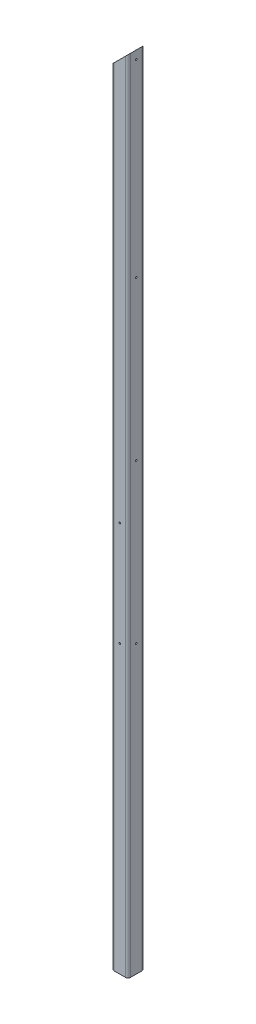
ISO-10303-21;
HEADER;
FILE_DESCRIPTION(('STEP AP214'),'2;1');
FILE_NAME('part.step','',(''),(''),'','','');
FILE_SCHEMA(('AUTOMOTIVE_DESIGN { 1 0 10303 214 1 1 1 1 }'));
ENDSEC;
DATA;
#1=APPLICATION_CONTEXT('core data for automotive mechanical design processes');
#2=APPLICATION_PROTOCOL_DEFINITION('international standard','automotive_design',2000,#1);
#3=PRODUCT_CONTEXT('',#1,'mechanical');
#4=PRODUCT('Part','Part','',(#3));
#5=PRODUCT_RELATED_PRODUCT_CATEGORY('part','',(#4));
#6=PRODUCT_DEFINITION_FORMATION('','',#4);
#7=PRODUCT_DEFINITION_CONTEXT('part definition',#1,'design');
#8=PRODUCT_DEFINITION('design','',#6,#7);
#9=PRODUCT_DEFINITION_SHAPE('','',#8);
#10=(LENGTH_UNIT() NAMED_UNIT(*) SI_UNIT(.MILLI.,.METRE.));
#11=(NAMED_UNIT(*) PLANE_ANGLE_UNIT() SI_UNIT($,.RADIAN.));
#12=(NAMED_UNIT(*) SI_UNIT($,.STERADIAN.) SOLID_ANGLE_UNIT());
#13=UNCERTAINTY_MEASURE_WITH_UNIT(LENGTH_MEASURE(1.E-05),#10,'distance_accuracy_value','');
#14=(GEOMETRIC_REPRESENTATION_CONTEXT(3) GLOBAL_UNCERTAINTY_ASSIGNED_CONTEXT((#13)) GLOBAL_UNIT_ASSIGNED_CONTEXT((#10,
#11,#12)) REPRESENTATION_CONTEXT('',''));
#15=CARTESIAN_POINT('',(0.,0.,0.));
#16=DIRECTION('',(0.,0.,1.));
#17=DIRECTION('',(1.,0.,0.));
#18=AXIS2_PLACEMENT_3D('',#15,#16,#17);
#19=CARTESIAN_POINT('',(-13.6,1920.,13.6));
#20=DIRECTION('',(0.,-1.,0.));
#21=DIRECTION('',(0.,0.,-1.));
#22=AXIS2_PLACEMENT_3D('',#19,#20,#21);
#23=CYLINDRICAL_SURFACE('',#22,6.4);
#24=CARTESIAN_POINT('',(-13.6,1886.4,13.6));
#25=DIRECTION('',(-0.707106781186548,0.707106781186547,0.));
#26=DIRECTION('',(-0.707106781186547,-0.707106781186548,0.));
#27=AXIS2_PLACEMENT_3D('',#24,#25,#26);
#28=ELLIPSE('',#27,9.05096679918782,6.4);
#29=CARTESIAN_POINT('',(-20.,1880.,13.6));
#30=VERTEX_POINT('',#29);
#31=CARTESIAN_POINT('',(-13.5999999999999,1886.4,20.));
#32=VERTEX_POINT('',#31);
#33=EDGE_CURVE('E245',#30,#32,#28,.T.);
#34=ORIENTED_EDGE('',*,*,#33,.F.);
#35=DIRECTION('',(0.,-1.,0.));
#36=VECTOR('',#35,1.);
#37=CARTESIAN_POINT('',(-20.,1920.,13.6));
#38=LINE('',#37,#36);
#39=CARTESIAN_POINT('',(-20.,0.,13.6));
#40=VERTEX_POINT('',#39);
#41=EDGE_CURVE('E161',#30,#40,#38,.T.);
#42=ORIENTED_EDGE('',*,*,#41,.T.);
#43=CARTESIAN_POINT('',(-13.6,0.,13.6));
#44=DIRECTION('',(0.,1.,0.));
#45=DIRECTION('',(0.,0.,1.));
#46=AXIS2_PLACEMENT_3D('',#43,#44,#45);
#47=CIRCLE('',#46,6.4);
#48=CARTESIAN_POINT('',(-13.6,0.,20.));
#49=VERTEX_POINT('',#48);
#50=EDGE_CURVE('E176',#40,#49,#47,.T.);
#51=ORIENTED_EDGE('',*,*,#50,.T.);
#52=DIRECTION('',(0.,-1.,0.));
#53=VECTOR('',#52,1.);
#54=CARTESIAN_POINT('',(-13.6,1920.,20.));
#55=LINE('',#54,#53);
#56=EDGE_CURVE('E12',#32,#49,#55,.T.);
#57=ORIENTED_EDGE('',*,*,#56,.F.);
#58=EDGE_LOOP('',(#34,#42,#51,#57));
#59=FACE_BOUND('',#58,.T.);
#60=ADVANCED_FACE('F66',(#59),#23,.T.);
#61=CARTESIAN_POINT('',(-13.6,1920.,20.));
#62=DIRECTION('',(0.,0.,-1.));
#63=DIRECTION('',(-1.,0.,0.));
#64=AXIS2_PLACEMENT_3D('',#61,#62,#63);
#65=PLANE('',#64);
#66=CARTESIAN_POINT('',(0.,687.,20.));
#67=DIRECTION('',(0.,0.,1.));
#68=DIRECTION('',(1.,0.,0.));
#69=AXIS2_PLACEMENT_3D('',#66,#67,#68);
#70=CIRCLE('',#69,2.);
#71=CARTESIAN_POINT('',(2.,687.,20.));
#72=VERTEX_POINT('',#71);
#73=EDGE_CURVE('E499',#72,#72,#70,.T.);
#74=ORIENTED_EDGE('',*,*,#73,.F.);
#75=EDGE_LOOP('',(#74));
#76=FACE_BOUND('',#75,.T.);
#77=CARTESIAN_POINT('',(0.,937.,20.));
#78=DIRECTION('',(0.,0.,1.));
#79=DIRECTION('',(1.,0.,0.));
#80=AXIS2_PLACEMENT_3D('',#77,#78,#79);
#81=CIRCLE('',#80,2.);
#82=CARTESIAN_POINT('',(1.99999999999991,937.,20.));
#83=VERTEX_POINT('',#82);
#84=EDGE_CURVE('E506',#83,#83,#81,.T.);
#85=ORIENTED_EDGE('',*,*,#84,.F.);
#86=EDGE_LOOP('',(#85));
#87=FACE_BOUND('',#86,.T.);
#88=DIRECTION('',(0.707106781186547,0.707106781186548,0.));
#89=VECTOR('',#88,1.);
#90=CARTESIAN_POINT('',(-950.,950.,20.));
#91=LINE('',#90,#89);
#92=CARTESIAN_POINT('',(13.6,1913.6,20.));
#93=VERTEX_POINT('',#92);
#94=EDGE_CURVE('E350',#32,#93,#91,.T.);
#95=ORIENTED_EDGE('',*,*,#94,.F.);
#96=ORIENTED_EDGE('',*,*,#56,.T.);
#97=DIRECTION('',(1.,0.,0.));
#98=VECTOR('',#97,1.);
#99=CARTESIAN_POINT('',(-13.6,0.,20.));
#100=LINE('',#99,#98);
#101=CARTESIAN_POINT('',(13.6,0.,20.));
#102=VERTEX_POINT('',#101);
#103=EDGE_CURVE('E274',#49,#102,#100,.T.);
#104=ORIENTED_EDGE('',*,*,#103,.T.);
#105=DIRECTION('',(0.,-1.,0.));
#106=VECTOR('',#105,1.);
#107=CARTESIAN_POINT('',(13.6,1920.,20.));
#108=LINE('',#107,#106);
#109=EDGE_CURVE('E76',#93,#102,#108,.T.);
#110=ORIENTED_EDGE('',*,*,#109,.F.);
#111=EDGE_LOOP('',(#95,#96,#104,#110));
#112=FACE_BOUND('',#111,.T.);
#113=ADVANCED_FACE('F356',(#76,#87,#112),#65,.F.);
#114=CARTESIAN_POINT('',(13.6,1920.,13.6));
#115=DIRECTION('',(0.,-1.,0.));
#116=DIRECTION('',(0.,0.,-1.));
#117=AXIS2_PLACEMENT_3D('',#114,#115,#116);
#118=CYLINDRICAL_SURFACE('',#117,6.4);
#119=CARTESIAN_POINT('',(13.6,1913.6,13.6));
#120=DIRECTION('',(-0.707106781186548,0.707106781186547,0.));
#121=DIRECTION('',(-0.707106781186547,-0.707106781186548,0.));
#122=AXIS2_PLACEMENT_3D('',#119,#120,#121);
#123=ELLIPSE('',#122,9.05096679918782,6.4);
#124=CARTESIAN_POINT('',(20.,1920.,13.6));
#125=VERTEX_POINT('',#124);
#126=EDGE_CURVE('E93',#93,#125,#123,.T.);
#127=ORIENTED_EDGE('',*,*,#126,.F.);
#128=ORIENTED_EDGE('',*,*,#109,.T.);
#129=CARTESIAN_POINT('',(13.6,0.,13.6));
#130=DIRECTION('',(0.,1.,0.));
#131=DIRECTION('',(0.,0.,1.));
#132=AXIS2_PLACEMENT_3D('',#129,#130,#131);
#133=CIRCLE('',#132,6.4);
#134=CARTESIAN_POINT('',(20.,0.,13.6));
#135=VERTEX_POINT('',#134);
#136=EDGE_CURVE('E278',#102,#135,#133,.T.);
#137=ORIENTED_EDGE('',*,*,#136,.T.);
#138=DIRECTION('',(0.,-1.,0.));
#139=VECTOR('',#138,1.);
#140=CARTESIAN_POINT('',(20.,1920.,13.6));
#141=LINE('',#140,#139);
#142=EDGE_CURVE('E196',#125,#135,#141,.T.);
#143=ORIENTED_EDGE('',*,*,#142,.F.);
#144=EDGE_LOOP('',(#127,#128,#137,#143));
#145=FACE_BOUND('',#144,.T.);
#146=ADVANCED_FACE('F425',(#145),#118,.T.);
#147=CARTESIAN_POINT('',(13.6,1920.,-13.6));
#148=DIRECTION('',(0.,-1.,0.));
#149=DIRECTION('',(0.,0.,-1.));
#150=AXIS2_PLACEMENT_3D('',#147,#148,#149);
#151=CYLINDRICAL_SURFACE('',#150,6.4);
#152=CARTESIAN_POINT('',(13.6,1913.6,-13.6));
#153=DIRECTION('',(-0.707106781186548,0.707106781186547,0.));
#154=DIRECTION('',(-0.707106781186547,-0.707106781186548,0.));
#155=AXIS2_PLACEMENT_3D('',#152,#153,#154);
#156=ELLIPSE('',#155,9.05096679918781,6.4);
#157=CARTESIAN_POINT('',(20.,1920.,-13.6));
#158=VERTEX_POINT('',#157);
#159=CARTESIAN_POINT('',(13.6000000000003,1913.6,-20.));
#160=VERTEX_POINT('',#159);
#161=EDGE_CURVE('E303',#158,#160,#156,.T.);
#162=ORIENTED_EDGE('',*,*,#161,.F.);
#163=DIRECTION('',(0.,-1.,0.));
#164=VECTOR('',#163,1.);
#165=CARTESIAN_POINT('',(20.,1920.,-13.6));
#166=LINE('',#165,#164);
#167=CARTESIAN_POINT('',(20.,0.,-13.6));
#168=VERTEX_POINT('',#167);
#169=EDGE_CURVE('E192',#158,#168,#166,.T.);
#170=ORIENTED_EDGE('',*,*,#169,.T.);
#171=CARTESIAN_POINT('',(13.6,0.,-13.6));
#172=DIRECTION('',(0.,1.,0.));
#173=DIRECTION('',(0.,0.,1.));
#174=AXIS2_PLACEMENT_3D('',#171,#172,#173);
#175=CIRCLE('',#174,6.4);
#176=CARTESIAN_POINT('',(13.6,0.,-20.));
#177=VERTEX_POINT('',#176);
#178=EDGE_CURVE('E284',#168,#177,#175,.T.);
#179=ORIENTED_EDGE('',*,*,#178,.T.);
#180=DIRECTION('',(0.,-1.,0.));
#181=VECTOR('',#180,1.);
#182=CARTESIAN_POINT('',(13.6,1920.,-20.));
#183=LINE('',#182,#181);
#184=EDGE_CURVE('E189',#160,#177,#183,.T.);
#185=ORIENTED_EDGE('',*,*,#184,.F.);
#186=EDGE_LOOP('',(#162,#170,#179,#185));
#187=FACE_BOUND('',#186,.T.);
#188=ADVANCED_FACE('F298',(#187),#151,.T.);
#189=CARTESIAN_POINT('',(13.6,1920.,-20.));
#190=DIRECTION('',(0.,0.,1.));
#191=DIRECTION('',(1.,0.,0.));
#192=AXIS2_PLACEMENT_3D('',#189,#190,#191);
#193=PLANE('',#192);
#194=DIRECTION('',(0.707106781186547,0.707106781186548,0.));
#195=VECTOR('',#194,1.);
#196=CARTESIAN_POINT('',(-950.,950.,-20.));
#197=LINE('',#196,#195);
#198=CARTESIAN_POINT('',(-13.6,1886.4,-20.));
#199=VERTEX_POINT('',#198);
#200=EDGE_CURVE('E358',#199,#160,#197,.T.);
#201=ORIENTED_EDGE('',*,*,#200,.T.);
#202=ORIENTED_EDGE('',*,*,#184,.T.);
#203=DIRECTION('',(-1.,0.,0.));
#204=VECTOR('',#203,1.);
#205=CARTESIAN_POINT('',(13.6,0.,-20.));
#206=LINE('',#205,#204);
#207=CARTESIAN_POINT('',(-13.6,0.,-20.));
#208=VERTEX_POINT('',#207);
#209=EDGE_CURVE('E171',#177,#208,#206,.T.);
#210=ORIENTED_EDGE('',*,*,#209,.T.);
#211=DIRECTION('',(0.,-1.,0.));
#212=VECTOR('',#211,1.);
#213=CARTESIAN_POINT('',(-13.6,1920.,-20.));
#214=LINE('',#213,#212);
#215=EDGE_CURVE('E160',#199,#208,#214,.T.);
#216=ORIENTED_EDGE('',*,*,#215,.F.);
#217=EDGE_LOOP('',(#201,#202,#210,#216));
#218=FACE_BOUND('',#217,.T.);
#219=ADVANCED_FACE('F290',(#218),#193,.F.);
#220=CARTESIAN_POINT('',(-13.6,1920.,-13.6));
#221=DIRECTION('',(0.,-1.,0.));
#222=DIRECTION('',(0.,0.,-1.));
#223=AXIS2_PLACEMENT_3D('',#220,#221,#222);
#224=CYLINDRICAL_SURFACE('',#223,6.4);
#225=CARTESIAN_POINT('',(-13.6,1886.4,-13.6));
#226=DIRECTION('',(-0.707106781186548,0.707106781186547,0.));
#227=DIRECTION('',(-0.707106781186547,-0.707106781186548,0.));
#228=AXIS2_PLACEMENT_3D('',#225,#226,#227);
#229=ELLIPSE('',#228,9.05096679918782,6.4);
#230=CARTESIAN_POINT('',(-20.,1880.,-13.6));
#231=VERTEX_POINT('',#230);
#232=EDGE_CURVE('E331',#199,#231,#229,.T.);
#233=ORIENTED_EDGE('',*,*,#232,.F.);
#234=ORIENTED_EDGE('',*,*,#215,.T.);
#235=CARTESIAN_POINT('',(-13.6,0.,-13.6));
#236=DIRECTION('',(0.,1.,0.));
#237=DIRECTION('',(0.,0.,1.));
#238=AXIS2_PLACEMENT_3D('',#235,#236,#237);
#239=CIRCLE('',#238,6.4);
#240=CARTESIAN_POINT('',(-20.,0.,-13.6));
#241=VERTEX_POINT('',#240);
#242=EDGE_CURVE('E164',#208,#241,#239,.T.);
#243=ORIENTED_EDGE('',*,*,#242,.T.);
#244=DIRECTION('',(0.,-1.,0.));
#245=VECTOR('',#244,1.);
#246=CARTESIAN_POINT('',(-20.,1920.,-13.6));
#247=LINE('',#246,#245);
#248=EDGE_CURVE('E147',#231,#241,#247,.T.);
#249=ORIENTED_EDGE('',*,*,#248,.F.);
#250=EDGE_LOOP('',(#233,#234,#243,#249));
#251=FACE_BOUND('',#250,.T.);
#252=ADVANCED_FACE('F165',(#251),#224,.T.);
#253=CARTESIAN_POINT('',(13.6,1920.,13.6));
#254=DIRECTION('',(0.,-1.,0.));
#255=DIRECTION('',(0.,0.,-1.));
#256=AXIS2_PLACEMENT_3D('',#253,#254,#255);
#257=CYLINDRICAL_SURFACE('',#256,3.2);
#258=DIRECTION('',(0.,-1.,0.));
#259=VECTOR('',#258,1.);
#260=CARTESIAN_POINT('',(13.6,1920.,16.8));
#261=LINE('',#260,#259);
#262=CARTESIAN_POINT('',(13.6,1913.6,16.8));
#263=VERTEX_POINT('',#262);
#264=CARTESIAN_POINT('',(13.6,0.,16.8));
#265=VERTEX_POINT('',#264);
#266=EDGE_CURVE('E70',#263,#265,#261,.T.);
#267=ORIENTED_EDGE('',*,*,#266,.F.);
#268=CARTESIAN_POINT('',(13.6,1913.6,13.6));
#269=DIRECTION('',(-0.707106781186548,0.707106781186547,0.));
#270=DIRECTION('',(-0.707106781186547,-0.707106781186548,0.));
#271=AXIS2_PLACEMENT_3D('',#268,#269,#270);
#272=ELLIPSE('',#271,4.52548339959391,3.2);
#273=CARTESIAN_POINT('',(16.8,1916.8,13.6));
#274=VERTEX_POINT('',#273);
#275=EDGE_CURVE('E327',#263,#274,#272,.T.);
#276=ORIENTED_EDGE('',*,*,#275,.T.);
#277=DIRECTION('',(0.,-1.,0.));
#278=VECTOR('',#277,1.);
#279=CARTESIAN_POINT('',(16.8,1920.,13.6));
#280=LINE('',#279,#278);
#281=CARTESIAN_POINT('',(16.8,0.,13.6));
#282=VERTEX_POINT('',#281);
#283=EDGE_CURVE('E181',#274,#282,#280,.T.);
#284=ORIENTED_EDGE('',*,*,#283,.T.);
#285=CARTESIAN_POINT('',(13.6,0.,13.6));
#286=DIRECTION('',(0.,1.,0.));
#287=DIRECTION('',(0.,0.,1.));
#288=AXIS2_PLACEMENT_3D('',#285,#286,#287);
#289=CIRCLE('',#288,3.2);
#290=EDGE_CURVE('E239',#265,#282,#289,.T.);
#291=ORIENTED_EDGE('',*,*,#290,.F.);
#292=EDGE_LOOP('',(#267,#276,#284,#291));
#293=FACE_BOUND('',#292,.T.);
#294=ADVANCED_FACE('F68',(#293),#257,.F.);
#295=CARTESIAN_POINT('',(-13.6,1920.,16.8));
#296=DIRECTION('',(0.,0.,-1.));
#297=DIRECTION('',(-1.,0.,0.));
#298=AXIS2_PLACEMENT_3D('',#295,#296,#297);
#299=PLANE('',#298);
#300=DIRECTION('',(0.,-1.,0.));
#301=VECTOR('',#300,1.);
#302=CARTESIAN_POINT('',(-13.6,1920.,16.8));
#303=LINE('',#302,#301);
#304=CARTESIAN_POINT('',(-13.6,1886.4,16.8));
#305=VERTEX_POINT('',#304);
#306=CARTESIAN_POINT('',(-13.6,0.,16.8));
#307=VERTEX_POINT('',#306);
#308=EDGE_CURVE('E218',#305,#307,#303,.T.);
#309=ORIENTED_EDGE('',*,*,#308,.F.);
#310=DIRECTION('',(0.707106781186547,0.707106781186548,0.));
#311=VECTOR('',#310,1.);
#312=CARTESIAN_POINT('',(3.19999999999985,1903.2,16.8));
#313=LINE('',#312,#311);
#314=EDGE_CURVE('E235',#305,#263,#313,.T.);
#315=ORIENTED_EDGE('',*,*,#314,.T.);
#316=ORIENTED_EDGE('',*,*,#266,.T.);
#317=DIRECTION('',(1.,0.,0.));
#318=VECTOR('',#317,1.);
#319=CARTESIAN_POINT('',(-13.6,0.,16.8));
#320=LINE('',#319,#318);
#321=EDGE_CURVE('E232',#307,#265,#320,.T.);
#322=ORIENTED_EDGE('',*,*,#321,.F.);
#323=EDGE_LOOP('',(#309,#315,#316,#322));
#324=FACE_BOUND('',#323,.T.);
#325=ADVANCED_FACE('F230',(#324),#299,.T.);
#326=CARTESIAN_POINT('',(-13.6,1920.,13.6));
#327=DIRECTION('',(0.,-1.,0.));
#328=DIRECTION('',(0.,0.,-1.));
#329=AXIS2_PLACEMENT_3D('',#326,#327,#328);
#330=CYLINDRICAL_SURFACE('',#329,3.2);
#331=DIRECTION('',(0.,-1.,0.));
#332=VECTOR('',#331,1.);
#333=CARTESIAN_POINT('',(-16.8,1920.,13.6));
#334=LINE('',#333,#332);
#335=CARTESIAN_POINT('',(-16.8,1883.2,13.6));
#336=VERTEX_POINT('',#335);
#337=CARTESIAN_POINT('',(-16.8,0.,13.6));
#338=VERTEX_POINT('',#337);
#339=EDGE_CURVE('E216',#336,#338,#334,.T.);
#340=ORIENTED_EDGE('',*,*,#339,.F.);
#341=CARTESIAN_POINT('',(-13.6,1886.4,13.6));
#342=DIRECTION('',(-0.707106781186548,0.707106781186547,0.));
#343=DIRECTION('',(-0.707106781186547,-0.707106781186548,0.));
#344=AXIS2_PLACEMENT_3D('',#341,#342,#343);
#345=ELLIPSE('',#344,4.5254833995939,3.2);
#346=EDGE_CURVE('E336',#336,#305,#345,.T.);
#347=ORIENTED_EDGE('',*,*,#346,.T.);
#348=ORIENTED_EDGE('',*,*,#308,.T.);
#349=CARTESIAN_POINT('',(-13.6,0.,13.6));
#350=DIRECTION('',(0.,1.,0.));
#351=DIRECTION('',(0.,0.,1.));
#352=AXIS2_PLACEMENT_3D('',#349,#350,#351);
#353=CIRCLE('',#352,3.2);
#354=EDGE_CURVE('E248',#338,#307,#353,.T.);
#355=ORIENTED_EDGE('',*,*,#354,.F.);
#356=EDGE_LOOP('',(#340,#347,#348,#355));
#357=FACE_BOUND('',#356,.T.);
#358=ADVANCED_FACE('F392',(#357),#330,.F.);
#359=CARTESIAN_POINT('',(-16.8,1920.,13.6));
#360=DIRECTION('',(1.,0.,0.));
#361=DIRECTION('',(0.,0.,-1.));
#362=AXIS2_PLACEMENT_3D('',#359,#360,#361);
#363=PLANE('',#362);
#364=DIRECTION('',(0.,-1.,0.));
#365=VECTOR('',#364,1.);
#366=CARTESIAN_POINT('',(-16.8,1920.,-13.6));
#367=LINE('',#366,#365);
#368=CARTESIAN_POINT('',(-16.8,1883.2,-13.6));
#369=VERTEX_POINT('',#368);
#370=CARTESIAN_POINT('',(-16.8,0.,-13.6));
#371=VERTEX_POINT('',#370);
#372=EDGE_CURVE('E213',#369,#371,#367,.T.);
#373=ORIENTED_EDGE('',*,*,#372,.F.);
#374=DIRECTION('',(0.,0.,1.));
#375=VECTOR('',#374,1.);
#376=CARTESIAN_POINT('',(-16.8,1883.2,13.6));
#377=LINE('',#376,#375);
#378=EDGE_CURVE('E387',#369,#336,#377,.T.);
#379=ORIENTED_EDGE('',*,*,#378,.T.);
#380=ORIENTED_EDGE('',*,*,#339,.T.);
#381=DIRECTION('',(0.,0.,1.));
#382=VECTOR('',#381,1.);
#383=CARTESIAN_POINT('',(-16.8,0.,13.6));
#384=LINE('',#383,#382);
#385=EDGE_CURVE('E252',#371,#338,#384,.T.);
#386=ORIENTED_EDGE('',*,*,#385,.F.);
#387=EDGE_LOOP('',(#373,#379,#380,#386));
#388=FACE_BOUND('',#387,.T.);
#389=ADVANCED_FACE('F395',(#388),#363,.T.);
#390=CARTESIAN_POINT('',(-13.6,1920.,-13.6));
#391=DIRECTION('',(0.,-1.,0.));
#392=DIRECTION('',(0.,0.,-1.));
#393=AXIS2_PLACEMENT_3D('',#390,#391,#392);
#394=CYLINDRICAL_SURFACE('',#393,3.2);
#395=DIRECTION('',(0.,-1.,0.));
#396=VECTOR('',#395,1.);
#397=CARTESIAN_POINT('',(-13.6,1920.,-16.8));
#398=LINE('',#397,#396);
#399=CARTESIAN_POINT('',(-13.6,1886.4,-16.8));
#400=VERTEX_POINT('',#399);
#401=CARTESIAN_POINT('',(-13.6,0.,-16.8));
#402=VERTEX_POINT('',#401);
#403=EDGE_CURVE('E210',#400,#402,#398,.T.);
#404=ORIENTED_EDGE('',*,*,#403,.F.);
#405=CARTESIAN_POINT('',(-13.6,1886.4,-13.6));
#406=DIRECTION('',(-0.707106781186548,0.707106781186547,0.));
#407=DIRECTION('',(-0.707106781186547,-0.707106781186548,0.));
#408=AXIS2_PLACEMENT_3D('',#405,#406,#407);
#409=ELLIPSE('',#408,4.5254833995939,3.2);
#410=EDGE_CURVE('E383',#400,#369,#409,.T.);
#411=ORIENTED_EDGE('',*,*,#410,.T.);
#412=ORIENTED_EDGE('',*,*,#372,.T.);
#413=CARTESIAN_POINT('',(-13.6,0.,-13.6));
#414=DIRECTION('',(0.,1.,0.));
#415=DIRECTION('',(0.,0.,1.));
#416=AXIS2_PLACEMENT_3D('',#413,#414,#415);
#417=CIRCLE('',#416,3.2);
#418=EDGE_CURVE('E257',#402,#371,#417,.T.);
#419=ORIENTED_EDGE('',*,*,#418,.F.);
#420=EDGE_LOOP('',(#404,#411,#412,#419));
#421=FACE_BOUND('',#420,.T.);
#422=ADVANCED_FACE('F400',(#421),#394,.F.);
#423=CARTESIAN_POINT('',(13.6,1920.,-16.8));
#424=DIRECTION('',(0.,0.,1.));
#425=DIRECTION('',(1.,0.,0.));
#426=AXIS2_PLACEMENT_3D('',#423,#424,#425);
#427=PLANE('',#426);
#428=DIRECTION('',(0.,-1.,0.));
#429=VECTOR('',#428,1.);
#430=CARTESIAN_POINT('',(13.6,1920.,-16.8));
#431=LINE('',#430,#429);
#432=CARTESIAN_POINT('',(13.6,1913.6,-16.8));
#433=VERTEX_POINT('',#432);
#434=CARTESIAN_POINT('',(13.6,0.,-16.8));
#435=VERTEX_POINT('',#434);
#436=EDGE_CURVE('E207',#433,#435,#431,.T.);
#437=ORIENTED_EDGE('',*,*,#436,.F.);
#438=DIRECTION('',(-0.707106781186547,-0.707106781186548,0.));
#439=VECTOR('',#438,1.);
#440=CARTESIAN_POINT('',(16.7999999999999,1916.8,-16.8));
#441=LINE('',#440,#439);
#442=EDGE_CURVE('E379',#433,#400,#441,.T.);
#443=ORIENTED_EDGE('',*,*,#442,.T.);
#444=ORIENTED_EDGE('',*,*,#403,.T.);
#445=DIRECTION('',(-1.,0.,0.));
#446=VECTOR('',#445,1.);
#447=CARTESIAN_POINT('',(13.6,0.,-16.8));
#448=LINE('',#447,#446);
#449=EDGE_CURVE('E261',#435,#402,#448,.T.);
#450=ORIENTED_EDGE('',*,*,#449,.F.);
#451=EDGE_LOOP('',(#437,#443,#444,#450));
#452=FACE_BOUND('',#451,.T.);
#453=ADVANCED_FACE('F403',(#452),#427,.T.);
#454=CARTESIAN_POINT('',(13.6,1920.,-13.6));
#455=DIRECTION('',(0.,-1.,0.));
#456=DIRECTION('',(0.,0.,-1.));
#457=AXIS2_PLACEMENT_3D('',#454,#455,#456);
#458=CYLINDRICAL_SURFACE('',#457,3.2);
#459=DIRECTION('',(0.,-1.,0.));
#460=VECTOR('',#459,1.);
#461=CARTESIAN_POINT('',(16.8,1920.,-13.6));
#462=LINE('',#461,#460);
#463=CARTESIAN_POINT('',(16.8,1916.8,-13.6));
#464=VERTEX_POINT('',#463);
#465=CARTESIAN_POINT('',(16.8,0.,-13.6));
#466=VERTEX_POINT('',#465);
#467=EDGE_CURVE('E204',#464,#466,#462,.T.);
#468=ORIENTED_EDGE('',*,*,#467,.F.);
#469=CARTESIAN_POINT('',(13.6,1913.6,-13.6));
#470=DIRECTION('',(-0.707106781186548,0.707106781186547,0.));
#471=DIRECTION('',(-0.707106781186547,-0.707106781186548,0.));
#472=AXIS2_PLACEMENT_3D('',#469,#470,#471);
#473=ELLIPSE('',#472,4.5254833995939,3.2);
#474=EDGE_CURVE('E84',#464,#433,#473,.T.);
#475=ORIENTED_EDGE('',*,*,#474,.T.);
#476=ORIENTED_EDGE('',*,*,#436,.T.);
#477=CARTESIAN_POINT('',(13.6,0.,-13.6));
#478=DIRECTION('',(0.,1.,0.));
#479=DIRECTION('',(0.,0.,1.));
#480=AXIS2_PLACEMENT_3D('',#477,#478,#479);
#481=CIRCLE('',#480,3.2);
#482=EDGE_CURVE('E265',#466,#435,#481,.T.);
#483=ORIENTED_EDGE('',*,*,#482,.F.);
#484=EDGE_LOOP('',(#468,#475,#476,#483));
#485=FACE_BOUND('',#484,.T.);
#486=ADVANCED_FACE('F408',(#485),#458,.F.);
#487=CARTESIAN_POINT('',(16.8,1920.,-13.6));
#488=DIRECTION('',(-1.,0.,0.));
#489=DIRECTION('',(0.,0.,1.));
#490=AXIS2_PLACEMENT_3D('',#487,#488,#489);
#491=PLANE('',#490);
#492=ORIENTED_EDGE('',*,*,#283,.F.);
#493=DIRECTION('',(0.,0.,-1.));
#494=VECTOR('',#493,1.);
#495=CARTESIAN_POINT('',(16.8,1916.8,-13.6));
#496=LINE('',#495,#494);
#497=EDGE_CURVE('E329',#274,#464,#496,.T.);
#498=ORIENTED_EDGE('',*,*,#497,.T.);
#499=ORIENTED_EDGE('',*,*,#467,.T.);
#500=DIRECTION('',(0.,0.,-1.));
#501=VECTOR('',#500,1.);
#502=CARTESIAN_POINT('',(16.8,0.,-13.6));
#503=LINE('',#502,#501);
#504=EDGE_CURVE('E269',#282,#466,#503,.T.);
#505=ORIENTED_EDGE('',*,*,#504,.F.);
#506=EDGE_LOOP('',(#492,#498,#499,#505));
#507=FACE_BOUND('',#506,.T.);
#508=ADVANCED_FACE('F410',(#507),#491,.T.);
#509=CARTESIAN_POINT('',(-20.,1920.,13.6));
#510=DIRECTION('',(1.,0.,0.));
#511=DIRECTION('',(0.,0.,-1.));
#512=AXIS2_PLACEMENT_3D('',#509,#510,#511);
#513=PLANE('',#512);
#514=DIRECTION('',(0.,0.,-1.));
#515=VECTOR('',#514,1.);
#516=CARTESIAN_POINT('',(-20.,1880.,20.));
#517=LINE('',#516,#515);
#518=EDGE_CURVE('E156',#30,#231,#517,.T.);
#519=ORIENTED_EDGE('',*,*,#518,.T.);
#520=ORIENTED_EDGE('',*,*,#248,.T.);
#521=DIRECTION('',(0.,0.,1.));
#522=VECTOR('',#521,1.);
#523=CARTESIAN_POINT('',(-20.,0.,13.6));
#524=LINE('',#523,#522);
#525=EDGE_CURVE('E152',#241,#40,#524,.T.);
#526=ORIENTED_EDGE('',*,*,#525,.T.);
#527=ORIENTED_EDGE('',*,*,#41,.F.);
#528=EDGE_LOOP('',(#519,#520,#526,#527));
#529=FACE_BOUND('',#528,.T.);
#530=ADVANCED_FACE('F149',(#529),#513,.F.);
#531=CARTESIAN_POINT('',(20.,1920.,-13.6));
#532=DIRECTION('',(-1.,0.,0.));
#533=DIRECTION('',(0.,0.,1.));
#534=AXIS2_PLACEMENT_3D('',#531,#532,#533);
#535=PLANE('',#534);
#536=CARTESIAN_POINT('',(20.,1900.,0.));
#537=DIRECTION('',(1.,0.,0.));
#538=DIRECTION('',(0.,0.,-1.));
#539=AXIS2_PLACEMENT_3D('',#536,#537,#538);
#540=CIRCLE('',#539,2.);
#541=CARTESIAN_POINT('',(20.,1900.,-2.00000000000001));
#542=VERTEX_POINT('',#541);
#543=EDGE_CURVE('E369',#542,#542,#540,.T.);
#544=ORIENTED_EDGE('',*,*,#543,.F.);
#545=EDGE_LOOP('',(#544));
#546=FACE_BOUND('',#545,.T.);
#547=CARTESIAN_POINT('',(20.,1447.,0.));
#548=DIRECTION('',(1.,0.,0.));
#549=DIRECTION('',(0.,0.,-1.));
#550=AXIS2_PLACEMENT_3D('',#547,#548,#549);
#551=CIRCLE('',#550,2.);
#552=CARTESIAN_POINT('',(20.,1447.,-2.00000000000007));
#553=VERTEX_POINT('',#552);
#554=EDGE_CURVE('E523',#553,#553,#551,.T.);
#555=ORIENTED_EDGE('',*,*,#554,.F.);
#556=EDGE_LOOP('',(#555));
#557=FACE_BOUND('',#556,.T.);
#558=CARTESIAN_POINT('',(20.,1067.,-1.10920259905105E-13));
#559=DIRECTION('',(1.,0.,0.));
#560=DIRECTION('',(0.,0.,-1.));
#561=AXIS2_PLACEMENT_3D('',#558,#559,#560);
#562=CIRCLE('',#561,2.);
#563=CARTESIAN_POINT('',(20.,1067.,-2.00000000000011));
#564=VERTEX_POINT('',#563);
#565=EDGE_CURVE('E531',#564,#564,#562,.T.);
#566=ORIENTED_EDGE('',*,*,#565,.F.);
#567=EDGE_LOOP('',(#566));
#568=FACE_BOUND('',#567,.T.);
#569=CARTESIAN_POINT('',(20.,687.,-1.57757793756479E-13));
#570=DIRECTION('',(1.,0.,0.));
#571=DIRECTION('',(0.,0.,-1.));
#572=AXIS2_PLACEMENT_3D('',#569,#570,#571);
#573=CIRCLE('',#572,2.);
#574=CARTESIAN_POINT('',(20.,687.,-2.00000000000016));
#575=VERTEX_POINT('',#574);
#576=EDGE_CURVE('E498',#575,#575,#573,.T.);
#577=ORIENTED_EDGE('',*,*,#576,.F.);
#578=EDGE_LOOP('',(#577));
#579=FACE_BOUND('',#578,.T.);
#580=DIRECTION('',(0.,0.,-1.));
#581=VECTOR('',#580,1.);
#582=CARTESIAN_POINT('',(20.,0.,-13.6));
#583=LINE('',#582,#581);
#584=EDGE_CURVE('E281',#135,#168,#583,.T.);
#585=ORIENTED_EDGE('',*,*,#584,.T.);
#586=ORIENTED_EDGE('',*,*,#169,.F.);
#587=DIRECTION('',(0.,0.,-1.));
#588=VECTOR('',#587,1.);
#589=CARTESIAN_POINT('',(20.,1920.,-13.6));
#590=LINE('',#589,#588);
#591=EDGE_CURVE('E178',#125,#158,#590,.T.);
#592=ORIENTED_EDGE('',*,*,#591,.F.);
#593=ORIENTED_EDGE('',*,*,#142,.T.);
#594=EDGE_LOOP('',(#585,#586,#592,#593));
#595=FACE_BOUND('',#594,.T.);
#596=ADVANCED_FACE('F306',(#546,#557,#568,#579,#595),#535,.F.);
#597=CARTESIAN_POINT('',(-13.6,0.,13.6));
#598=DIRECTION('',(0.,1.,0.));
#599=DIRECTION('',(0.,0.,1.));
#600=AXIS2_PLACEMENT_3D('',#597,#598,#599);
#601=PLANE('',#600);
#602=ORIENTED_EDGE('',*,*,#290,.T.);
#603=ORIENTED_EDGE('',*,*,#504,.T.);
#604=ORIENTED_EDGE('',*,*,#482,.T.);
#605=ORIENTED_EDGE('',*,*,#449,.T.);
#606=ORIENTED_EDGE('',*,*,#418,.T.);
#607=ORIENTED_EDGE('',*,*,#385,.T.);
#608=ORIENTED_EDGE('',*,*,#354,.T.);
#609=ORIENTED_EDGE('',*,*,#321,.T.);
#610=EDGE_LOOP('',(#602,#603,#604,#605,#606,#607,#608,#609));
#611=FACE_BOUND('',#610,.T.);
#612=ORIENTED_EDGE('',*,*,#50,.F.);
#613=ORIENTED_EDGE('',*,*,#525,.F.);
#614=ORIENTED_EDGE('',*,*,#242,.F.);
#615=ORIENTED_EDGE('',*,*,#209,.F.);
#616=ORIENTED_EDGE('',*,*,#178,.F.);
#617=ORIENTED_EDGE('',*,*,#584,.F.);
#618=ORIENTED_EDGE('',*,*,#136,.F.);
#619=ORIENTED_EDGE('',*,*,#103,.F.);
#620=EDGE_LOOP('',(#612,#613,#614,#615,#616,#617,#618,#619));
#621=FACE_BOUND('',#620,.T.);
#622=ADVANCED_FACE('F173',(#611,#621),#601,.F.);
#623=CARTESIAN_POINT('',(-950.,950.,20.));
#624=DIRECTION('',(-0.707106781186548,0.707106781186547,0.));
#625=DIRECTION('',(-0.707106781186547,-0.707106781186548,0.));
#626=AXIS2_PLACEMENT_3D('',#623,#624,#625);
#627=PLANE('',#626);
#628=ORIENTED_EDGE('',*,*,#314,.F.);
#629=ORIENTED_EDGE('',*,*,#346,.F.);
#630=ORIENTED_EDGE('',*,*,#378,.F.);
#631=ORIENTED_EDGE('',*,*,#410,.F.);
#632=ORIENTED_EDGE('',*,*,#442,.F.);
#633=ORIENTED_EDGE('',*,*,#474,.F.);
#634=ORIENTED_EDGE('',*,*,#497,.F.);
#635=ORIENTED_EDGE('',*,*,#275,.F.);
#636=EDGE_LOOP('',(#628,#629,#630,#631,#632,#633,#634,#635));
#637=FACE_BOUND('',#636,.T.);
#638=ORIENTED_EDGE('',*,*,#33,.T.);
#639=ORIENTED_EDGE('',*,*,#94,.T.);
#640=ORIENTED_EDGE('',*,*,#126,.T.);
#641=ORIENTED_EDGE('',*,*,#591,.T.);
#642=ORIENTED_EDGE('',*,*,#161,.T.);
#643=ORIENTED_EDGE('',*,*,#200,.F.);
#644=ORIENTED_EDGE('',*,*,#232,.T.);
#645=ORIENTED_EDGE('',*,*,#518,.F.);
#646=EDGE_LOOP('',(#638,#639,#640,#641,#642,#643,#644,#645));
#647=FACE_BOUND('',#646,.T.);
#648=ADVANCED_FACE('F328',(#637,#647),#627,.T.);
#649=CARTESIAN_POINT('',(17.,687.,-1.56992474575901E-13));
#650=DIRECTION('',(1.,0.,0.));
#651=DIRECTION('',(0.,0.,-1.));
#652=AXIS2_PLACEMENT_3D('',#649,#650,#651);
#653=CYLINDRICAL_SURFACE('',#652,2.);
#654=CARTESIAN_POINT('',(17.,687.,-1.56992474575901E-13));
#655=DIRECTION('',(1.,0.,0.));
#656=DIRECTION('',(0.,0.,-1.));
#657=AXIS2_PLACEMENT_3D('',#654,#655,#656);
#658=CIRCLE('',#657,2.);
#659=CARTESIAN_POINT('',(17.,687.,-2.00000000000016));
#660=VERTEX_POINT('',#659);
#661=EDGE_CURVE('E504',#660,#660,#658,.T.);
#662=ORIENTED_EDGE('',*,*,#661,.F.);
#663=EDGE_LOOP('',(#662));
#664=FACE_BOUND('',#663,.T.);
#665=ORIENTED_EDGE('',*,*,#576,.T.);
#666=EDGE_LOOP('',(#665));
#667=FACE_BOUND('',#666,.T.);
#668=ADVANCED_FACE('F445',(#664,#667),#653,.F.);
#669=CARTESIAN_POINT('',(17.,687.,-1.56992474575901E-13));
#670=DIRECTION('',(1.,0.,0.));
#671=DIRECTION('',(0.,0.,-1.));
#672=AXIS2_PLACEMENT_3D('',#669,#670,#671);
#673=PLANE('',#672);
#674=ORIENTED_EDGE('',*,*,#661,.T.);
#675=EDGE_LOOP('',(#674));
#676=FACE_BOUND('',#675,.T.);
#677=ADVANCED_FACE('F448',(#676),#673,.T.);
#678=CARTESIAN_POINT('',(17.,1067.,-1.10154940724527E-13));
#679=DIRECTION('',(1.,0.,0.));
#680=DIRECTION('',(0.,0.,-1.));
#681=AXIS2_PLACEMENT_3D('',#678,#679,#680);
#682=CYLINDRICAL_SURFACE('',#681,2.);
#683=CARTESIAN_POINT('',(17.,1067.,-1.10154940724527E-13));
#684=DIRECTION('',(1.,0.,0.));
#685=DIRECTION('',(0.,0.,-1.));
#686=AXIS2_PLACEMENT_3D('',#683,#684,#685);
#687=CIRCLE('',#686,2.);
#688=CARTESIAN_POINT('',(17.,1067.,-2.00000000000011));
#689=VERTEX_POINT('',#688);
#690=EDGE_CURVE('E527',#689,#689,#687,.T.);
#691=ORIENTED_EDGE('',*,*,#690,.F.);
#692=EDGE_LOOP('',(#691));
#693=FACE_BOUND('',#692,.T.);
#694=ORIENTED_EDGE('',*,*,#565,.T.);
#695=EDGE_LOOP('',(#694));
#696=FACE_BOUND('',#695,.T.);
#697=ADVANCED_FACE('F452',(#693,#696),#682,.F.);
#698=CARTESIAN_POINT('',(17.,1067.,-1.10154940724527E-13));
#699=DIRECTION('',(1.,0.,0.));
#700=DIRECTION('',(0.,0.,-1.));
#701=AXIS2_PLACEMENT_3D('',#698,#699,#700);
#702=PLANE('',#701);
#703=ORIENTED_EDGE('',*,*,#690,.T.);
#704=EDGE_LOOP('',(#703));
#705=FACE_BOUND('',#704,.T.);
#706=ADVANCED_FACE('F456',(#705),#702,.T.);
#707=CARTESIAN_POINT('',(17.,1447.,0.));
#708=DIRECTION('',(1.,0.,0.));
#709=DIRECTION('',(0.,0.,-1.));
#710=AXIS2_PLACEMENT_3D('',#707,#708,#709);
#711=CYLINDRICAL_SURFACE('',#710,2.);
#712=CARTESIAN_POINT('',(17.,1447.,0.));
#713=DIRECTION('',(1.,0.,0.));
#714=DIRECTION('',(0.,0.,-1.));
#715=AXIS2_PLACEMENT_3D('',#712,#713,#714);
#716=CIRCLE('',#715,2.);
#717=CARTESIAN_POINT('',(17.,1447.,-2.00000000000006));
#718=VERTEX_POINT('',#717);
#719=EDGE_CURVE('E519',#718,#718,#716,.T.);
#720=ORIENTED_EDGE('',*,*,#719,.F.);
#721=EDGE_LOOP('',(#720));
#722=FACE_BOUND('',#721,.T.);
#723=ORIENTED_EDGE('',*,*,#554,.T.);
#724=EDGE_LOOP('',(#723));
#725=FACE_BOUND('',#724,.T.);
#726=ADVANCED_FACE('F460',(#722,#725),#711,.F.);
#727=CARTESIAN_POINT('',(17.,1447.,0.));
#728=DIRECTION('',(1.,0.,0.));
#729=DIRECTION('',(0.,0.,-1.));
#730=AXIS2_PLACEMENT_3D('',#727,#728,#729);
#731=PLANE('',#730);
#732=ORIENTED_EDGE('',*,*,#719,.T.);
#733=EDGE_LOOP('',(#732));
#734=FACE_BOUND('',#733,.T.);
#735=ADVANCED_FACE('F464',(#734),#731,.T.);
#736=CARTESIAN_POINT('',(17.,1900.,0.));
#737=DIRECTION('',(1.,0.,0.));
#738=DIRECTION('',(0.,0.,-1.));
#739=AXIS2_PLACEMENT_3D('',#736,#737,#738);
#740=CYLINDRICAL_SURFACE('',#739,2.);
#741=CARTESIAN_POINT('',(17.,1900.,0.));
#742=DIRECTION('',(1.,0.,0.));
#743=DIRECTION('',(0.,0.,-1.));
#744=AXIS2_PLACEMENT_3D('',#741,#742,#743);
#745=CIRCLE('',#744,2.);
#746=CARTESIAN_POINT('',(17.,1900.,-2.00000000000001));
#747=VERTEX_POINT('',#746);
#748=EDGE_CURVE('E365',#747,#747,#745,.T.);
#749=ORIENTED_EDGE('',*,*,#748,.F.);
#750=EDGE_LOOP('',(#749));
#751=FACE_BOUND('',#750,.T.);
#752=ORIENTED_EDGE('',*,*,#543,.T.);
#753=EDGE_LOOP('',(#752));
#754=FACE_BOUND('',#753,.T.);
#755=ADVANCED_FACE('F468',(#751,#754),#740,.F.);
#756=CARTESIAN_POINT('',(17.,1900.,0.));
#757=DIRECTION('',(1.,0.,0.));
#758=DIRECTION('',(0.,0.,-1.));
#759=AXIS2_PLACEMENT_3D('',#756,#757,#758);
#760=PLANE('',#759);
#761=ORIENTED_EDGE('',*,*,#748,.T.);
#762=EDGE_LOOP('',(#761));
#763=FACE_BOUND('',#762,.T.);
#764=ADVANCED_FACE('F472',(#763),#760,.T.);
#765=CARTESIAN_POINT('',(0.,937.,17.));
#766=DIRECTION('',(0.,0.,1.));
#767=DIRECTION('',(1.,0.,0.));
#768=AXIS2_PLACEMENT_3D('',#765,#766,#767);
#769=CYLINDRICAL_SURFACE('',#768,2.);
#770=CARTESIAN_POINT('',(0.,937.,17.));
#771=DIRECTION('',(0.,0.,1.));
#772=DIRECTION('',(1.,0.,0.));
#773=AXIS2_PLACEMENT_3D('',#770,#771,#772);
#774=CIRCLE('',#773,2.);
#775=CARTESIAN_POINT('',(1.99999999999991,937.,17.));
#776=VERTEX_POINT('',#775);
#777=EDGE_CURVE('E512',#776,#776,#774,.T.);
#778=ORIENTED_EDGE('',*,*,#777,.F.);
#779=EDGE_LOOP('',(#778));
#780=FACE_BOUND('',#779,.T.);
#781=ORIENTED_EDGE('',*,*,#84,.T.);
#782=EDGE_LOOP('',(#781));
#783=FACE_BOUND('',#782,.T.);
#784=ADVANCED_FACE('F476',(#780,#783),#769,.F.);
#785=CARTESIAN_POINT('',(0.,937.,17.));
#786=DIRECTION('',(0.,0.,1.));
#787=DIRECTION('',(1.,0.,0.));
#788=AXIS2_PLACEMENT_3D('',#785,#786,#787);
#789=PLANE('',#788);
#790=ORIENTED_EDGE('',*,*,#777,.T.);
#791=EDGE_LOOP('',(#790));
#792=FACE_BOUND('',#791,.T.);
#793=ADVANCED_FACE('F478',(#792),#789,.T.);
#794=CARTESIAN_POINT('',(0.,687.,17.));
#795=DIRECTION('',(0.,0.,1.));
#796=DIRECTION('',(1.,0.,0.));
#797=AXIS2_PLACEMENT_3D('',#794,#795,#796);
#798=CYLINDRICAL_SURFACE('',#797,2.);
#799=CARTESIAN_POINT('',(0.,687.,17.));
#800=DIRECTION('',(0.,0.,1.));
#801=DIRECTION('',(1.,0.,0.));
#802=AXIS2_PLACEMENT_3D('',#799,#800,#801);
#803=CIRCLE('',#802,2.);
#804=CARTESIAN_POINT('',(2.,687.,17.));
#805=VERTEX_POINT('',#804);
#806=EDGE_CURVE('E496',#805,#805,#803,.T.);
#807=ORIENTED_EDGE('',*,*,#806,.F.);
#808=EDGE_LOOP('',(#807));
#809=FACE_BOUND('',#808,.T.);
#810=ORIENTED_EDGE('',*,*,#73,.T.);
#811=EDGE_LOOP('',(#810));
#812=FACE_BOUND('',#811,.T.);
#813=ADVANCED_FACE('F481',(#809,#812),#798,.F.);
#814=CARTESIAN_POINT('',(0.,687.,17.));
#815=DIRECTION('',(0.,0.,1.));
#816=DIRECTION('',(1.,0.,0.));
#817=AXIS2_PLACEMENT_3D('',#814,#815,#816);
#818=PLANE('',#817);
#819=ORIENTED_EDGE('',*,*,#806,.T.);
#820=EDGE_LOOP('',(#819));
#821=FACE_BOUND('',#820,.T.);
#822=ADVANCED_FACE('F488',(#821),#818,.T.);
#823=CLOSED_SHELL('',(#60,#113,#146,#188,#219,#252,#294,#325,#358,#389,#422,#453,#486,#508,#530,
#596,#622,#648,#668,#677,#697,#706,#726,#735,#755,#764,#784,#793,#813,#822));
#824=MANIFOLD_SOLID_BREP('B2',#823);
#825=ADVANCED_BREP_SHAPE_REPRESENTATION('',(#18,#824),#14);
#826=SHAPE_DEFINITION_REPRESENTATION(#9,#825);
ENDSEC;
END-ISO-10303-21;
